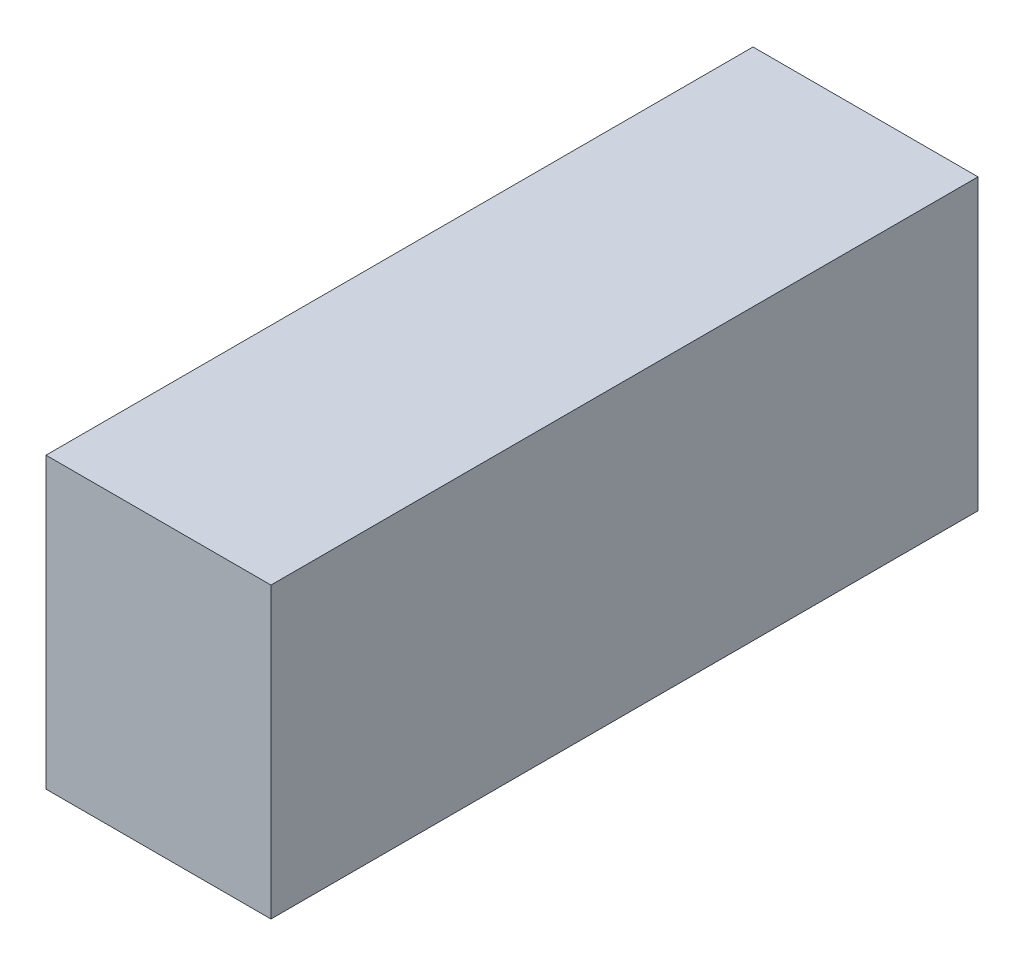
ISO-10303-21;
HEADER;
FILE_DESCRIPTION(('STEP AP214'),'2;1');
FILE_NAME('part.step','',(''),(''),'','','');
FILE_SCHEMA(('AUTOMOTIVE_DESIGN { 1 0 10303 214 1 1 1 1 }'));
ENDSEC;
DATA;
#1=APPLICATION_CONTEXT('core data for automotive mechanical design processes');
#2=APPLICATION_PROTOCOL_DEFINITION('international standard','automotive_design',2000,#1);
#3=PRODUCT_CONTEXT('',#1,'mechanical');
#4=PRODUCT('Part','Part','',(#3));
#5=PRODUCT_RELATED_PRODUCT_CATEGORY('part','',(#4));
#6=PRODUCT_DEFINITION_FORMATION('','',#4);
#7=PRODUCT_DEFINITION_CONTEXT('part definition',#1,'design');
#8=PRODUCT_DEFINITION('design','',#6,#7);
#9=PRODUCT_DEFINITION_SHAPE('','',#8);
#10=(LENGTH_UNIT() NAMED_UNIT(*) SI_UNIT(.MILLI.,.METRE.));
#11=(NAMED_UNIT(*) PLANE_ANGLE_UNIT() SI_UNIT($,.RADIAN.));
#12=(NAMED_UNIT(*) SI_UNIT($,.STERADIAN.) SOLID_ANGLE_UNIT());
#13=UNCERTAINTY_MEASURE_WITH_UNIT(LENGTH_MEASURE(1.E-05),#10,'distance_accuracy_value','');
#14=(GEOMETRIC_REPRESENTATION_CONTEXT(3) GLOBAL_UNCERTAINTY_ASSIGNED_CONTEXT((#13)) GLOBAL_UNIT_ASSIGNED_CONTEXT((#10,
#11,#12)) REPRESENTATION_CONTEXT('',''));
#15=CARTESIAN_POINT('',(0.,0.,0.));
#16=DIRECTION('',(0.,0.,1.));
#17=DIRECTION('',(1.,0.,0.));
#18=AXIS2_PLACEMENT_3D('',#15,#16,#17);
#19=CARTESIAN_POINT('',(-22.225,57.15,-69.85));
#20=DIRECTION('',(1.,0.,0.));
#21=DIRECTION('',(0.,0.,-1.));
#22=AXIS2_PLACEMENT_3D('',#19,#20,#21);
#23=PLANE('',#22);
#24=DIRECTION('',(0.,0.,1.));
#25=VECTOR('',#24,1.);
#26=CARTESIAN_POINT('',(-22.225,0.,-69.85));
#27=LINE('',#26,#25);
#28=CARTESIAN_POINT('',(-22.225,0.,-69.85));
#29=VERTEX_POINT('',#28);
#30=CARTESIAN_POINT('',(-22.225,0.,69.85));
#31=VERTEX_POINT('',#30);
#32=EDGE_CURVE('E99',#29,#31,#27,.T.);
#33=ORIENTED_EDGE('',*,*,#32,.T.);
#34=DIRECTION('',(0.,-1.,0.));
#35=VECTOR('',#34,1.);
#36=CARTESIAN_POINT('',(-22.225,57.15,69.85));
#37=LINE('',#36,#35);
#38=CARTESIAN_POINT('',(-22.225,57.15,69.85));
#39=VERTEX_POINT('',#38);
#40=EDGE_CURVE('E11',#39,#31,#37,.T.);
#41=ORIENTED_EDGE('',*,*,#40,.F.);
#42=DIRECTION('',(0.,0.,1.));
#43=VECTOR('',#42,1.);
#44=CARTESIAN_POINT('',(-22.225,57.15,-69.85));
#45=LINE('',#44,#43);
#46=CARTESIAN_POINT('',(-22.225,57.15,-69.85));
#47=VERTEX_POINT('',#46);
#48=EDGE_CURVE('E87',#47,#39,#45,.T.);
#49=ORIENTED_EDGE('',*,*,#48,.F.);
#50=DIRECTION('',(0.,-1.,0.));
#51=VECTOR('',#50,1.);
#52=CARTESIAN_POINT('',(-22.225,57.15,-69.85));
#53=LINE('',#52,#51);
#54=EDGE_CURVE('E95',#47,#29,#53,.T.);
#55=ORIENTED_EDGE('',*,*,#54,.T.);
#56=EDGE_LOOP('',(#33,#41,#49,#55));
#57=FACE_BOUND('',#56,.T.);
#58=ADVANCED_FACE('F36',(#57),#23,.F.);
#59=CARTESIAN_POINT('',(-22.225,57.15,69.85));
#60=DIRECTION('',(0.,0.,-1.));
#61=DIRECTION('',(-1.,0.,0.));
#62=AXIS2_PLACEMENT_3D('',#59,#60,#61);
#63=PLANE('',#62);
#64=DIRECTION('',(1.,0.,0.));
#65=VECTOR('',#64,1.);
#66=CARTESIAN_POINT('',(-22.225,0.,69.85));
#67=LINE('',#66,#65);
#68=CARTESIAN_POINT('',(22.225,0.,69.85));
#69=VERTEX_POINT('',#68);
#70=EDGE_CURVE('E91',#31,#69,#67,.T.);
#71=ORIENTED_EDGE('',*,*,#70,.T.);
#72=DIRECTION('',(0.,-1.,0.));
#73=VECTOR('',#72,1.);
#74=CARTESIAN_POINT('',(22.225,57.15,69.85));
#75=LINE('',#74,#73);
#76=CARTESIAN_POINT('',(22.225,57.15,69.85));
#77=VERTEX_POINT('',#76);
#78=EDGE_CURVE('E44',#77,#69,#75,.T.);
#79=ORIENTED_EDGE('',*,*,#78,.F.);
#80=DIRECTION('',(1.,0.,0.));
#81=VECTOR('',#80,1.);
#82=CARTESIAN_POINT('',(-22.225,57.15,69.85));
#83=LINE('',#82,#81);
#84=EDGE_CURVE('E82',#39,#77,#83,.T.);
#85=ORIENTED_EDGE('',*,*,#84,.F.);
#86=ORIENTED_EDGE('',*,*,#40,.T.);
#87=EDGE_LOOP('',(#71,#79,#85,#86));
#88=FACE_BOUND('',#87,.T.);
#89=ADVANCED_FACE('F90',(#88),#63,.F.);
#90=CARTESIAN_POINT('',(22.225,57.15,-69.85));
#91=DIRECTION('',(-1.,0.,0.));
#92=DIRECTION('',(0.,0.,1.));
#93=AXIS2_PLACEMENT_3D('',#90,#91,#92);
#94=PLANE('',#93);
#95=DIRECTION('',(0.,0.,-1.));
#96=VECTOR('',#95,1.);
#97=CARTESIAN_POINT('',(22.225,0.,-69.85));
#98=LINE('',#97,#96);
#99=CARTESIAN_POINT('',(22.225,0.,-69.85));
#100=VERTEX_POINT('',#99);
#101=EDGE_CURVE('E69',#69,#100,#98,.T.);
#102=ORIENTED_EDGE('',*,*,#101,.T.);
#103=DIRECTION('',(0.,-1.,0.));
#104=VECTOR('',#103,1.);
#105=CARTESIAN_POINT('',(22.225,57.15,-69.85));
#106=LINE('',#105,#104);
#107=CARTESIAN_POINT('',(22.225,57.15,-69.85));
#108=VERTEX_POINT('',#107);
#109=EDGE_CURVE('E92',#108,#100,#106,.T.);
#110=ORIENTED_EDGE('',*,*,#109,.F.);
#111=DIRECTION('',(0.,0.,-1.));
#112=VECTOR('',#111,1.);
#113=CARTESIAN_POINT('',(22.225,57.15,-69.85));
#114=LINE('',#113,#112);
#115=EDGE_CURVE('E85',#77,#108,#114,.T.);
#116=ORIENTED_EDGE('',*,*,#115,.F.);
#117=ORIENTED_EDGE('',*,*,#78,.T.);
#118=EDGE_LOOP('',(#102,#110,#116,#117));
#119=FACE_BOUND('',#118,.T.);
#120=ADVANCED_FACE('F93',(#119),#94,.F.);
#121=CARTESIAN_POINT('',(-22.225,57.15,-69.85));
#122=DIRECTION('',(0.,0.,1.));
#123=DIRECTION('',(1.,0.,0.));
#124=AXIS2_PLACEMENT_3D('',#121,#122,#123);
#125=PLANE('',#124);
#126=DIRECTION('',(-1.,0.,0.));
#127=VECTOR('',#126,1.);
#128=CARTESIAN_POINT('',(-22.225,0.,-69.85));
#129=LINE('',#128,#127);
#130=EDGE_CURVE('E75',#100,#29,#129,.T.);
#131=ORIENTED_EDGE('',*,*,#130,.T.);
#132=ORIENTED_EDGE('',*,*,#54,.F.);
#133=DIRECTION('',(-1.,0.,0.));
#134=VECTOR('',#133,1.);
#135=CARTESIAN_POINT('',(-22.225,57.15,-69.85));
#136=LINE('',#135,#134);
#137=EDGE_CURVE('E52',#108,#47,#136,.T.);
#138=ORIENTED_EDGE('',*,*,#137,.F.);
#139=ORIENTED_EDGE('',*,*,#109,.T.);
#140=EDGE_LOOP('',(#131,#132,#138,#139));
#141=FACE_BOUND('',#140,.T.);
#142=ADVANCED_FACE('F106',(#141),#125,.F.);
#143=CARTESIAN_POINT('',(0.,57.15,0.));
#144=DIRECTION('',(0.,1.,0.));
#145=DIRECTION('',(0.,0.,1.));
#146=AXIS2_PLACEMENT_3D('',#143,#144,#145);
#147=PLANE('',#146);
#148=ORIENTED_EDGE('',*,*,#48,.T.);
#149=ORIENTED_EDGE('',*,*,#84,.T.);
#150=ORIENTED_EDGE('',*,*,#115,.T.);
#151=ORIENTED_EDGE('',*,*,#137,.T.);
#152=EDGE_LOOP('',(#148,#149,#150,#151));
#153=FACE_BOUND('',#152,.T.);
#154=ADVANCED_FACE('F83',(#153),#147,.T.);
#155=CARTESIAN_POINT('',(0.,0.,0.));
#156=DIRECTION('',(0.,1.,0.));
#157=DIRECTION('',(0.,0.,1.));
#158=AXIS2_PLACEMENT_3D('',#155,#156,#157);
#159=PLANE('',#158);
#160=ORIENTED_EDGE('',*,*,#32,.F.);
#161=ORIENTED_EDGE('',*,*,#130,.F.);
#162=ORIENTED_EDGE('',*,*,#101,.F.);
#163=ORIENTED_EDGE('',*,*,#70,.F.);
#164=EDGE_LOOP('',(#160,#161,#162,#163));
#165=FACE_BOUND('',#164,.T.);
#166=ADVANCED_FACE('F109',(#165),#159,.F.);
#167=CLOSED_SHELL('',(#58,#89,#120,#142,#154,#166));
#168=MANIFOLD_SOLID_BREP('B2',#167);
#169=ADVANCED_BREP_SHAPE_REPRESENTATION('',(#18,#168),#14);
#170=SHAPE_DEFINITION_REPRESENTATION(#9,#169);
ENDSEC;
END-ISO-10303-21;
